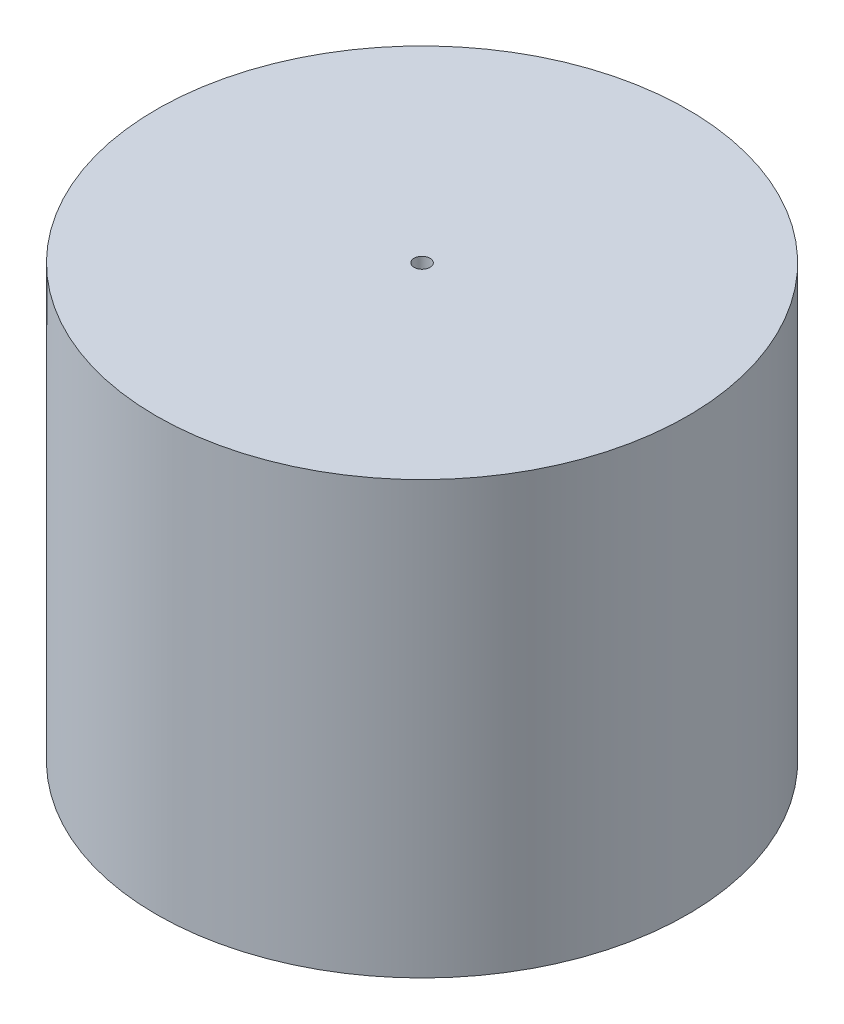
ISO-10303-21;
HEADER;
FILE_DESCRIPTION(('STEP AP214'),'2;1');
FILE_NAME('part.step','',(''),(''),'','','');
FILE_SCHEMA(('AUTOMOTIVE_DESIGN { 1 0 10303 214 1 1 1 1 }'));
ENDSEC;
DATA;
#1=APPLICATION_CONTEXT('core data for automotive mechanical design processes');
#2=APPLICATION_PROTOCOL_DEFINITION('international standard','automotive_design',2000,#1);
#3=PRODUCT_CONTEXT('',#1,'mechanical');
#4=PRODUCT('Part','Part','',(#3));
#5=PRODUCT_RELATED_PRODUCT_CATEGORY('part','',(#4));
#6=PRODUCT_DEFINITION_FORMATION('','',#4);
#7=PRODUCT_DEFINITION_CONTEXT('part definition',#1,'design');
#8=PRODUCT_DEFINITION('design','',#6,#7);
#9=PRODUCT_DEFINITION_SHAPE('','',#8);
#10=(LENGTH_UNIT() NAMED_UNIT(*) SI_UNIT(.MILLI.,.METRE.));
#11=(NAMED_UNIT(*) PLANE_ANGLE_UNIT() SI_UNIT($,.RADIAN.));
#12=(NAMED_UNIT(*) SI_UNIT($,.STERADIAN.) SOLID_ANGLE_UNIT());
#13=UNCERTAINTY_MEASURE_WITH_UNIT(LENGTH_MEASURE(1.E-05),#10,'distance_accuracy_value','');
#14=(GEOMETRIC_REPRESENTATION_CONTEXT(3) GLOBAL_UNCERTAINTY_ASSIGNED_CONTEXT((#13)) GLOBAL_UNIT_ASSIGNED_CONTEXT((#10,
#11,#12)) REPRESENTATION_CONTEXT('',''));
#15=CARTESIAN_POINT('',(0.,0.,0.));
#16=DIRECTION('',(0.,0.,1.));
#17=DIRECTION('',(1.,0.,0.));
#18=AXIS2_PLACEMENT_3D('',#15,#16,#17);
#19=CARTESIAN_POINT('',(0.,-7.5,0.));
#20=DIRECTION('',(0.,1.,0.));
#21=DIRECTION('',(0.,0.,1.));
#22=AXIS2_PLACEMENT_3D('',#19,#20,#21);
#23=PLANE('',#22);
#24=CARTESIAN_POINT('',(0.,-7.5,0.));
#25=DIRECTION('',(0.,1.,0.));
#26=DIRECTION('',(0.,0.,1.));
#27=AXIS2_PLACEMENT_3D('',#24,#25,#26);
#28=CIRCLE('',#27,3.6);
#29=CARTESIAN_POINT('',(0.,-7.5,3.6));
#30=VERTEX_POINT('',#29);
#31=EDGE_CURVE('E11',#30,#30,#28,.T.);
#32=ORIENTED_EDGE('',*,*,#31,.T.);
#33=EDGE_LOOP('',(#32));
#34=FACE_BOUND('',#33,.T.);
#35=CARTESIAN_POINT('',(0.,-7.5,0.));
#36=DIRECTION('',(0.,-1.,0.));
#37=DIRECTION('',(0.,0.,-1.));
#38=AXIS2_PLACEMENT_3D('',#35,#36,#37);
#39=CIRCLE('',#38,12.5);
#40=CARTESIAN_POINT('',(0.,-7.5,-12.5));
#41=VERTEX_POINT('',#40);
#42=CARTESIAN_POINT('',(0.,-7.5,12.5));
#43=VERTEX_POINT('',#42);
#44=EDGE_CURVE('E177',#41,#43,#39,.T.);
#45=ORIENTED_EDGE('',*,*,#44,.T.);
#46=DIRECTION('',(1.,0.,0.));
#47=VECTOR('',#46,1.);
#48=CARTESIAN_POINT('',(-20.,-7.5,12.5));
#49=LINE('',#48,#47);
#50=CARTESIAN_POINT('',(-15.612494995996,-7.5,12.5));
#51=VERTEX_POINT('',#50);
#52=EDGE_CURVE('E264',#51,#43,#49,.T.);
#53=ORIENTED_EDGE('',*,*,#52,.F.);
#54=CARTESIAN_POINT('',(0.,-7.5,0.));
#55=DIRECTION('',(0.,1.,0.));
#56=DIRECTION('',(0.,0.,1.));
#57=AXIS2_PLACEMENT_3D('',#54,#55,#56);
#58=CIRCLE('',#57,20.);
#59=CARTESIAN_POINT('',(-15.612494995996,-7.5,-12.5));
#60=VERTEX_POINT('',#59);
#61=EDGE_CURVE('E314',#51,#60,#58,.F.);
#62=ORIENTED_EDGE('',*,*,#61,.T.);
#63=DIRECTION('',(1.,0.,0.));
#64=VECTOR('',#63,1.);
#65=CARTESIAN_POINT('',(-20.,-7.5,-12.5));
#66=LINE('',#65,#64);
#67=EDGE_CURVE('E267',#60,#41,#66,.T.);
#68=ORIENTED_EDGE('',*,*,#67,.T.);
#69=EDGE_LOOP('',(#45,#53,#62,#68));
#70=FACE_BOUND('',#69,.T.);
#71=ADVANCED_FACE('F36',(#34,#70),#23,.F.);
#72=CARTESIAN_POINT('',(0.,-22.5,0.));
#73=DIRECTION('',(0.,1.,0.));
#74=DIRECTION('',(0.,0.,1.));
#75=AXIS2_PLACEMENT_3D('',#72,#73,#74);
#76=CYLINDRICAL_SURFACE('',#75,12.5);
#77=DIRECTION('',(0.,1.,0.));
#78=VECTOR('',#77,1.);
#79=CARTESIAN_POINT('',(-10.,-22.5,-7.5));
#80=LINE('',#79,#78);
#81=CARTESIAN_POINT('',(-10.,-22.5,-7.5));
#82=VERTEX_POINT('',#81);
#83=CARTESIAN_POINT('',(-10.,-17.5,-7.5));
#84=VERTEX_POINT('',#83);
#85=EDGE_CURVE('E306',#82,#84,#80,.T.);
#86=ORIENTED_EDGE('',*,*,#85,.F.);
#87=CARTESIAN_POINT('',(0.,-22.5,0.));
#88=DIRECTION('',(0.,-1.,0.));
#89=DIRECTION('',(0.,0.,-1.));
#90=AXIS2_PLACEMENT_3D('',#87,#88,#89);
#91=CIRCLE('',#90,12.5);
#92=CARTESIAN_POINT('',(-10.,-22.5,7.5));
#93=VERTEX_POINT('',#92);
#94=EDGE_CURVE('E252',#82,#93,#91,.T.);
#95=ORIENTED_EDGE('',*,*,#94,.T.);
#96=DIRECTION('',(0.,1.,0.));
#97=VECTOR('',#96,1.);
#98=CARTESIAN_POINT('',(-10.,-22.5,7.5));
#99=LINE('',#98,#97);
#100=CARTESIAN_POINT('',(-10.,-17.5,7.5));
#101=VERTEX_POINT('',#100);
#102=EDGE_CURVE('E245',#101,#93,#99,.F.);
#103=ORIENTED_EDGE('',*,*,#102,.F.);
#104=CARTESIAN_POINT('',(0.,-17.5,0.));
#105=DIRECTION('',(0.,-1.,0.));
#106=DIRECTION('',(0.,0.,-1.));
#107=AXIS2_PLACEMENT_3D('',#104,#105,#106);
#108=CIRCLE('',#107,12.5);
#109=CARTESIAN_POINT('',(0.,-17.5,12.5));
#110=VERTEX_POINT('',#109);
#111=EDGE_CURVE('E174',#110,#101,#108,.T.);
#112=ORIENTED_EDGE('',*,*,#111,.F.);
#113=DIRECTION('',(0.,-1.,0.));
#114=VECTOR('',#113,1.);
#115=CARTESIAN_POINT('',(0.,-7.5,12.5));
#116=LINE('',#115,#114);
#117=EDGE_CURVE('E276',#43,#110,#116,.T.);
#118=ORIENTED_EDGE('',*,*,#117,.F.);
#119=ORIENTED_EDGE('',*,*,#44,.F.);
#120=DIRECTION('',(0.,1.,0.));
#121=VECTOR('',#120,1.);
#122=CARTESIAN_POINT('',(0.,-7.5,-12.5));
#123=LINE('',#122,#121);
#124=CARTESIAN_POINT('',(0.,-17.5,-12.5));
#125=VERTEX_POINT('',#124);
#126=EDGE_CURVE('E273',#125,#41,#123,.T.);
#127=ORIENTED_EDGE('',*,*,#126,.F.);
#128=CARTESIAN_POINT('',(0.,-17.5,0.));
#129=DIRECTION('',(0.,-1.,0.));
#130=DIRECTION('',(0.,0.,-1.));
#131=AXIS2_PLACEMENT_3D('',#128,#129,#130);
#132=CIRCLE('',#131,12.5);
#133=EDGE_CURVE('E182',#84,#125,#132,.T.);
#134=ORIENTED_EDGE('',*,*,#133,.F.);
#135=EDGE_LOOP('',(#86,#95,#103,#112,#118,#119,#127,#134));
#136=FACE_BOUND('',#135,.T.);
#137=ADVANCED_FACE('F201',(#136),#76,.F.);
#138=CARTESIAN_POINT('',(0.,-22.5,0.));
#139=DIRECTION('',(0.,-1.,0.));
#140=DIRECTION('',(0.,0.,-1.));
#141=AXIS2_PLACEMENT_3D('',#138,#139,#140);
#142=PLANE('',#141);
#143=ORIENTED_EDGE('',*,*,#94,.F.);
#144=DIRECTION('',(1.,0.,0.));
#145=VECTOR('',#144,1.);
#146=CARTESIAN_POINT('',(0.,-22.5,-7.5));
#147=LINE('',#146,#145);
#148=CARTESIAN_POINT('',(-6.88856760882264,-22.5,-7.5));
#149=VERTEX_POINT('',#148);
#150=EDGE_CURVE('E304',#82,#149,#147,.T.);
#151=ORIENTED_EDGE('',*,*,#150,.T.);
#152=DIRECTION('',(0.851038037822176,0.,-0.525104045099427));
#153=VECTOR('',#152,1.);
#154=CARTESIAN_POINT('',(-10.1645108532667,-22.5,-5.47869076031458));
#155=LINE('',#154,#153);
#156=CARTESIAN_POINT('',(-0.337570048721829,-22.5,-11.5420699961289));
#157=VERTEX_POINT('',#156);
#158=EDGE_CURVE('E59',#149,#157,#155,.T.);
#159=ORIENTED_EDGE('',*,*,#158,.T.);
#160=DIRECTION('',(0.880272461597161,0.,0.474468537791152));
#161=VECTOR('',#160,1.);
#162=CARTESIAN_POINT('',(-0.337570048721829,-22.5,-11.5420699961289));
#163=LINE('',#162,#161);
#164=CARTESIAN_POINT('',(9.82694080454485,-22.5,-6.0633792358143));
#165=VERTEX_POINT('',#164);
#166=EDGE_CURVE('E332',#157,#165,#163,.T.);
#167=ORIENTED_EDGE('',*,*,#166,.T.);
#168=DIRECTION('',(0.0292344237749851,0.,0.99957258289058));
#169=VECTOR('',#168,1.);
#170=CARTESIAN_POINT('',(9.82694080454485,-22.5,-6.0633792358143));
#171=LINE('',#170,#169);
#172=CARTESIAN_POINT('',(10.1645108532667,-22.5,5.47869076031458));
#173=VERTEX_POINT('',#172);
#174=EDGE_CURVE('E334',#165,#173,#171,.T.);
#175=ORIENTED_EDGE('',*,*,#174,.T.);
#176=DIRECTION('',(-0.851038037822176,0.,0.525104045099427));
#177=VECTOR('',#176,1.);
#178=CARTESIAN_POINT('',(10.1645108532667,-22.5,5.47869076031458));
#179=LINE('',#178,#177);
#180=CARTESIAN_POINT('',(0.337570048721818,-22.5,11.5420699961289));
#181=VERTEX_POINT('',#180);
#182=EDGE_CURVE('E337',#173,#181,#179,.T.);
#183=ORIENTED_EDGE('',*,*,#182,.T.);
#184=DIRECTION('',(-0.880272461597161,0.,-0.474468537791153));
#185=VECTOR('',#184,1.);
#186=CARTESIAN_POINT('',(0.337570048721818,-22.5,11.5420699961289));
#187=LINE('',#186,#185);
#188=CARTESIAN_POINT('',(-7.16160560158564,-22.5,7.5));
#189=VERTEX_POINT('',#188);
#190=EDGE_CURVE('E322',#181,#189,#187,.T.);
#191=ORIENTED_EDGE('',*,*,#190,.T.);
#192=DIRECTION('',(-1.,0.,0.));
#193=VECTOR('',#192,1.);
#194=CARTESIAN_POINT('',(0.,-22.5,7.5));
#195=LINE('',#194,#193);
#196=EDGE_CURVE('E299',#189,#93,#195,.T.);
#197=ORIENTED_EDGE('',*,*,#196,.T.);
#198=EDGE_LOOP('',(#143,#151,#159,#167,#175,#183,#191,#197));
#199=FACE_BOUND('',#198,.T.);
#200=ADVANCED_FACE('F209',(#199),#142,.F.);
#201=CARTESIAN_POINT('',(-10.1645108532667,-27.5,-5.47869076031458));
#202=DIRECTION('',(0.525104045099427,0.,0.851038037822176));
#203=DIRECTION('',(0.851038037822176,0.,-0.525104045099427));
#204=AXIS2_PLACEMENT_3D('',#201,#202,#203);
#205=PLANE('',#204);
#206=DIRECTION('',(0.,1.,0.));
#207=VECTOR('',#206,1.);
#208=CARTESIAN_POINT('',(-6.88856760882264,-27.5,-7.5));
#209=LINE('',#208,#207);
#210=CARTESIAN_POINT('',(-6.88856760882264,-27.5,-7.5));
#211=VERTEX_POINT('',#210);
#212=EDGE_CURVE('E244',#211,#149,#209,.T.);
#213=ORIENTED_EDGE('',*,*,#212,.F.);
#214=DIRECTION('',(0.851038037822176,0.,-0.525104045099427));
#215=VECTOR('',#214,1.);
#216=CARTESIAN_POINT('',(-10.1645108532667,-27.5,-5.47869076031458));
#217=LINE('',#216,#215);
#218=CARTESIAN_POINT('',(-0.337570048721829,-27.5,-11.5420699961289));
#219=VERTEX_POINT('',#218);
#220=EDGE_CURVE('E319',#211,#219,#217,.T.);
#221=ORIENTED_EDGE('',*,*,#220,.T.);
#222=DIRECTION('',(0.,1.,0.));
#223=VECTOR('',#222,1.);
#224=CARTESIAN_POINT('',(-0.337570048721829,-27.5,-11.5420699961289));
#225=LINE('',#224,#223);
#226=EDGE_CURVE('E253',#219,#157,#225,.T.);
#227=ORIENTED_EDGE('',*,*,#226,.T.);
#228=ORIENTED_EDGE('',*,*,#158,.F.);
#229=EDGE_LOOP('',(#213,#221,#227,#228));
#230=FACE_BOUND('',#229,.T.);
#231=ADVANCED_FACE('F357',(#230),#205,.T.);
#232=CARTESIAN_POINT('',(-0.337570048721829,-27.5,-11.5420699961289));
#233=DIRECTION('',(-0.474468537791152,0.,0.880272461597161));
#234=DIRECTION('',(0.880272461597161,0.,0.474468537791152));
#235=AXIS2_PLACEMENT_3D('',#232,#233,#234);
#236=PLANE('',#235);
#237=ORIENTED_EDGE('',*,*,#166,.F.);
#238=ORIENTED_EDGE('',*,*,#226,.F.);
#239=DIRECTION('',(0.880272461597161,0.,0.474468537791152));
#240=VECTOR('',#239,1.);
#241=CARTESIAN_POINT('',(-0.337570048721829,-27.5,-11.5420699961289));
#242=LINE('',#241,#240);
#243=CARTESIAN_POINT('',(9.82694080454485,-27.5,-6.0633792358143));
#244=VERTEX_POINT('',#243);
#245=EDGE_CURVE('E321',#219,#244,#242,.T.);
#246=ORIENTED_EDGE('',*,*,#245,.T.);
#247=DIRECTION('',(0.,1.,0.));
#248=VECTOR('',#247,1.);
#249=CARTESIAN_POINT('',(9.82694080454485,-27.5,-6.0633792358143));
#250=LINE('',#249,#248);
#251=EDGE_CURVE('E258',#244,#165,#250,.T.);
#252=ORIENTED_EDGE('',*,*,#251,.T.);
#253=EDGE_LOOP('',(#237,#238,#246,#252));
#254=FACE_BOUND('',#253,.T.);
#255=ADVANCED_FACE('F347',(#254),#236,.T.);
#256=CARTESIAN_POINT('',(9.82694080454485,-27.5,-6.0633792358143));
#257=DIRECTION('',(-0.99957258289058,0.,0.0292344237749851));
#258=DIRECTION('',(0.0292344237749851,0.,0.99957258289058));
#259=AXIS2_PLACEMENT_3D('',#256,#257,#258);
#260=PLANE('',#259);
#261=ORIENTED_EDGE('',*,*,#174,.F.);
#262=ORIENTED_EDGE('',*,*,#251,.F.);
#263=DIRECTION('',(0.0292344237749851,0.,0.99957258289058));
#264=VECTOR('',#263,1.);
#265=CARTESIAN_POINT('',(9.82694080454485,-27.5,-6.0633792358143));
#266=LINE('',#265,#264);
#267=CARTESIAN_POINT('',(10.1645108532667,-27.5,5.47869076031458));
#268=VERTEX_POINT('',#267);
#269=EDGE_CURVE('E324',#244,#268,#266,.T.);
#270=ORIENTED_EDGE('',*,*,#269,.T.);
#271=DIRECTION('',(0.,1.,0.));
#272=VECTOR('',#271,1.);
#273=CARTESIAN_POINT('',(10.1645108532667,-27.5,5.47869076031458));
#274=LINE('',#273,#272);
#275=EDGE_CURVE('E343',#268,#173,#274,.T.);
#276=ORIENTED_EDGE('',*,*,#275,.T.);
#277=EDGE_LOOP('',(#261,#262,#270,#276));
#278=FACE_BOUND('',#277,.T.);
#279=ADVANCED_FACE('F352',(#278),#260,.T.);
#280=CARTESIAN_POINT('',(10.1645108532667,-27.5,5.47869076031458));
#281=DIRECTION('',(-0.525104045099427,0.,-0.851038037822176));
#282=DIRECTION('',(-0.851038037822176,0.,0.525104045099427));
#283=AXIS2_PLACEMENT_3D('',#280,#281,#282);
#284=PLANE('',#283);
#285=ORIENTED_EDGE('',*,*,#182,.F.);
#286=ORIENTED_EDGE('',*,*,#275,.F.);
#287=DIRECTION('',(-0.851038037822176,0.,0.525104045099427));
#288=VECTOR('',#287,1.);
#289=CARTESIAN_POINT('',(10.1645108532667,-27.5,5.47869076031458));
#290=LINE('',#289,#288);
#291=CARTESIAN_POINT('',(0.337570048721818,-27.5,11.5420699961289));
#292=VERTEX_POINT('',#291);
#293=EDGE_CURVE('E326',#268,#292,#290,.T.);
#294=ORIENTED_EDGE('',*,*,#293,.T.);
#295=DIRECTION('',(0.,1.,0.));
#296=VECTOR('',#295,1.);
#297=CARTESIAN_POINT('',(0.337570048721818,-27.5,11.5420699961289));
#298=LINE('',#297,#296);
#299=EDGE_CURVE('E330',#292,#181,#298,.T.);
#300=ORIENTED_EDGE('',*,*,#299,.T.);
#301=EDGE_LOOP('',(#285,#286,#294,#300));
#302=FACE_BOUND('',#301,.T.);
#303=ADVANCED_FACE('F370',(#302),#284,.T.);
#304=CARTESIAN_POINT('',(0.337570048721818,-27.5,11.5420699961289));
#305=DIRECTION('',(0.474468537791153,0.,-0.880272461597161));
#306=DIRECTION('',(-0.880272461597161,0.,-0.474468537791153));
#307=AXIS2_PLACEMENT_3D('',#304,#305,#306);
#308=PLANE('',#307);
#309=DIRECTION('',(0.,-1.,0.));
#310=VECTOR('',#309,1.);
#311=CARTESIAN_POINT('',(-7.16160560158564,-27.5,7.5));
#312=LINE('',#311,#310);
#313=CARTESIAN_POINT('',(-7.16160560158564,-27.5,7.5));
#314=VERTEX_POINT('',#313);
#315=EDGE_CURVE('E170',#189,#314,#312,.T.);
#316=ORIENTED_EDGE('',*,*,#315,.F.);
#317=ORIENTED_EDGE('',*,*,#190,.F.);
#318=ORIENTED_EDGE('',*,*,#299,.F.);
#319=DIRECTION('',(-0.880272461597161,0.,-0.474468537791153));
#320=VECTOR('',#319,1.);
#321=CARTESIAN_POINT('',(0.337570048721818,-27.5,11.5420699961289));
#322=LINE('',#321,#320);
#323=EDGE_CURVE('E328',#292,#314,#322,.T.);
#324=ORIENTED_EDGE('',*,*,#323,.T.);
#325=EDGE_LOOP('',(#316,#317,#318,#324));
#326=FACE_BOUND('',#325,.T.);
#327=ADVANCED_FACE('F373',(#326),#308,.T.);
#328=CARTESIAN_POINT('',(0.,-27.5,0.));
#329=DIRECTION('',(0.,-1.,0.));
#330=DIRECTION('',(0.,0.,-1.));
#331=AXIS2_PLACEMENT_3D('',#328,#329,#330);
#332=PLANE('',#331);
#333=DIRECTION('',(1.,0.,0.));
#334=VECTOR('',#333,1.);
#335=CARTESIAN_POINT('',(0.,-27.5,-7.5));
#336=LINE('',#335,#334);
#337=CARTESIAN_POINT('',(-2.78388218141501,-27.5,-7.5));
#338=VERTEX_POINT('',#337);
#339=EDGE_CURVE('E165',#211,#338,#336,.T.);
#340=ORIENTED_EDGE('',*,*,#339,.T.);
#341=CARTESIAN_POINT('',(0.,-27.5,0.));
#342=DIRECTION('',(0.,-1.,0.));
#343=DIRECTION('',(0.,0.,-1.));
#344=AXIS2_PLACEMENT_3D('',#341,#342,#343);
#345=CIRCLE('',#344,8.);
#346=CARTESIAN_POINT('',(-2.78388218141501,-27.5,7.5));
#347=VERTEX_POINT('',#346);
#348=EDGE_CURVE('E152',#338,#347,#345,.T.);
#349=ORIENTED_EDGE('',*,*,#348,.T.);
#350=DIRECTION('',(-1.,0.,0.));
#351=VECTOR('',#350,1.);
#352=CARTESIAN_POINT('',(0.,-27.5,7.5));
#353=LINE('',#352,#351);
#354=EDGE_CURVE('E162',#347,#314,#353,.T.);
#355=ORIENTED_EDGE('',*,*,#354,.T.);
#356=ORIENTED_EDGE('',*,*,#323,.F.);
#357=ORIENTED_EDGE('',*,*,#293,.F.);
#358=ORIENTED_EDGE('',*,*,#269,.F.);
#359=ORIENTED_EDGE('',*,*,#245,.F.);
#360=ORIENTED_EDGE('',*,*,#220,.F.);
#361=EDGE_LOOP('',(#340,#349,#355,#356,#357,#358,#359,#360));
#362=FACE_BOUND('',#361,.T.);
#363=ADVANCED_FACE('F160',(#362),#332,.F.);
#364=CARTESIAN_POINT('',(-20.,-17.5,-7.5));
#365=DIRECTION('',(0.,0.,-1.));
#366=DIRECTION('',(0.,1.,0.));
#367=AXIS2_PLACEMENT_3D('',#364,#365,#366);
#368=PLANE('',#367);
#369=DIRECTION('',(1.,0.,0.));
#370=VECTOR('',#369,1.);
#371=CARTESIAN_POINT('',(-20.,-32.5,-7.5));
#372=LINE('',#371,#370);
#373=CARTESIAN_POINT('',(-18.5404962177392,-32.5,-7.5));
#374=VERTEX_POINT('',#373);
#375=CARTESIAN_POINT('',(-2.78388218141501,-32.5,-7.5));
#376=VERTEX_POINT('',#375);
#377=EDGE_CURVE('E251',#374,#376,#372,.T.);
#378=ORIENTED_EDGE('',*,*,#377,.T.);
#379=DIRECTION('',(0.,-1.,0.));
#380=VECTOR('',#379,1.);
#381=CARTESIAN_POINT('',(-2.78388218141501,-27.5,-7.5));
#382=LINE('',#381,#380);
#383=EDGE_CURVE('E51',#376,#338,#382,.F.);
#384=ORIENTED_EDGE('',*,*,#383,.T.);
#385=ORIENTED_EDGE('',*,*,#339,.F.);
#386=ORIENTED_EDGE('',*,*,#212,.T.);
#387=ORIENTED_EDGE('',*,*,#150,.F.);
#388=ORIENTED_EDGE('',*,*,#85,.T.);
#389=DIRECTION('',(1.,0.,0.));
#390=VECTOR('',#389,1.);
#391=CARTESIAN_POINT('',(-20.,-17.5,-7.5));
#392=LINE('',#391,#390);
#393=CARTESIAN_POINT('',(-18.5404962177392,-17.5,-7.5));
#394=VERTEX_POINT('',#393);
#395=EDGE_CURVE('E280',#394,#84,#392,.T.);
#396=ORIENTED_EDGE('',*,*,#395,.F.);
#397=DIRECTION('',(0.,1.,0.));
#398=VECTOR('',#397,1.);
#399=CARTESIAN_POINT('',(-18.5404962177392,-7.5,-7.5));
#400=LINE('',#399,#398);
#401=EDGE_CURVE('E308',#394,#374,#400,.F.);
#402=ORIENTED_EDGE('',*,*,#401,.T.);
#403=EDGE_LOOP('',(#378,#384,#385,#386,#387,#388,#396,#402));
#404=FACE_BOUND('',#403,.T.);
#405=ADVANCED_FACE('F380',(#404),#368,.F.);
#406=CARTESIAN_POINT('',(-20.,-17.5,7.5));
#407=DIRECTION('',(0.,0.,1.));
#408=DIRECTION('',(0.,-1.,0.));
#409=AXIS2_PLACEMENT_3D('',#406,#407,#408);
#410=PLANE('',#409);
#411=ORIENTED_EDGE('',*,*,#354,.F.);
#412=DIRECTION('',(0.,-1.,0.));
#413=VECTOR('',#412,1.);
#414=CARTESIAN_POINT('',(-2.78388218141501,-27.5,7.5));
#415=LINE('',#414,#413);
#416=CARTESIAN_POINT('',(-2.78388218141501,-32.5,7.5));
#417=VERTEX_POINT('',#416);
#418=EDGE_CURVE('E149',#347,#417,#415,.T.);
#419=ORIENTED_EDGE('',*,*,#418,.T.);
#420=DIRECTION('',(1.,0.,0.));
#421=VECTOR('',#420,1.);
#422=CARTESIAN_POINT('',(-20.,-32.5,7.5));
#423=LINE('',#422,#421);
#424=CARTESIAN_POINT('',(-18.5404962177392,-32.5,7.5));
#425=VERTEX_POINT('',#424);
#426=EDGE_CURVE('E249',#425,#417,#423,.T.);
#427=ORIENTED_EDGE('',*,*,#426,.F.);
#428=DIRECTION('',(0.,1.,0.));
#429=VECTOR('',#428,1.);
#430=CARTESIAN_POINT('',(-18.5404962177392,-7.5,7.5));
#431=LINE('',#430,#429);
#432=CARTESIAN_POINT('',(-18.5404962177392,-17.5,7.5));
#433=VERTEX_POINT('',#432);
#434=EDGE_CURVE('E234',#425,#433,#431,.T.);
#435=ORIENTED_EDGE('',*,*,#434,.T.);
#436=DIRECTION('',(1.,0.,0.));
#437=VECTOR('',#436,1.);
#438=CARTESIAN_POINT('',(-20.,-17.5,7.5));
#439=LINE('',#438,#437);
#440=EDGE_CURVE('E290',#433,#101,#439,.T.);
#441=ORIENTED_EDGE('',*,*,#440,.T.);
#442=ORIENTED_EDGE('',*,*,#102,.T.);
#443=ORIENTED_EDGE('',*,*,#196,.F.);
#444=ORIENTED_EDGE('',*,*,#315,.T.);
#445=EDGE_LOOP('',(#411,#419,#427,#435,#441,#442,#443,#444));
#446=FACE_BOUND('',#445,.T.);
#447=ADVANCED_FACE('F168',(#446),#410,.F.);
#448=CARTESIAN_POINT('',(-20.,-17.5,12.5));
#449=DIRECTION('',(0.,-1.,0.));
#450=DIRECTION('',(0.,0.,-1.));
#451=AXIS2_PLACEMENT_3D('',#448,#449,#450);
#452=PLANE('',#451);
#453=CARTESIAN_POINT('',(0.,-17.5,0.));
#454=DIRECTION('',(0.,-1.,0.));
#455=DIRECTION('',(0.,0.,-1.));
#456=AXIS2_PLACEMENT_3D('',#453,#454,#455);
#457=CIRCLE('',#456,20.);
#458=CARTESIAN_POINT('',(-15.612494995996,-17.5,12.5));
#459=VERTEX_POINT('',#458);
#460=EDGE_CURVE('E241',#433,#459,#457,.F.);
#461=ORIENTED_EDGE('',*,*,#460,.T.);
#462=DIRECTION('',(1.,0.,0.));
#463=VECTOR('',#462,1.);
#464=CARTESIAN_POINT('',(-20.,-17.5,12.5));
#465=LINE('',#464,#463);
#466=EDGE_CURVE('E292',#459,#110,#465,.T.);
#467=ORIENTED_EDGE('',*,*,#466,.T.);
#468=ORIENTED_EDGE('',*,*,#111,.T.);
#469=ORIENTED_EDGE('',*,*,#440,.F.);
#470=EDGE_LOOP('',(#461,#467,#468,#469));
#471=FACE_BOUND('',#470,.T.);
#472=ADVANCED_FACE('F390',(#471),#452,.F.);
#473=CARTESIAN_POINT('',(-20.,-7.5,12.5));
#474=DIRECTION('',(0.,0.,1.));
#475=DIRECTION('',(0.,-1.,0.));
#476=AXIS2_PLACEMENT_3D('',#473,#474,#475);
#477=PLANE('',#476);
#478=DIRECTION('',(0.,1.,0.));
#479=VECTOR('',#478,1.);
#480=CARTESIAN_POINT('',(-15.612494995996,-7.5,12.5));
#481=LINE('',#480,#479);
#482=EDGE_CURVE('E316',#459,#51,#481,.T.);
#483=ORIENTED_EDGE('',*,*,#482,.T.);
#484=ORIENTED_EDGE('',*,*,#52,.T.);
#485=ORIENTED_EDGE('',*,*,#117,.T.);
#486=ORIENTED_EDGE('',*,*,#466,.F.);
#487=EDGE_LOOP('',(#483,#484,#485,#486));
#488=FACE_BOUND('',#487,.T.);
#489=ADVANCED_FACE('F386',(#488),#477,.F.);
#490=CARTESIAN_POINT('',(-20.,-7.5,-12.5));
#491=DIRECTION('',(0.,0.,-1.));
#492=DIRECTION('',(-1.,0.,0.));
#493=AXIS2_PLACEMENT_3D('',#490,#491,#492);
#494=PLANE('',#493);
#495=DIRECTION('',(0.,1.,0.));
#496=VECTOR('',#495,1.);
#497=CARTESIAN_POINT('',(-15.612494995996,-7.5,-12.5));
#498=LINE('',#497,#496);
#499=CARTESIAN_POINT('',(-15.612494995996,-17.5,-12.5));
#500=VERTEX_POINT('',#499);
#501=EDGE_CURVE('E312',#60,#500,#498,.F.);
#502=ORIENTED_EDGE('',*,*,#501,.T.);
#503=DIRECTION('',(1.,0.,0.));
#504=VECTOR('',#503,1.);
#505=CARTESIAN_POINT('',(-20.,-17.5,-12.5));
#506=LINE('',#505,#504);
#507=EDGE_CURVE('E283',#500,#125,#506,.T.);
#508=ORIENTED_EDGE('',*,*,#507,.T.);
#509=ORIENTED_EDGE('',*,*,#126,.T.);
#510=ORIENTED_EDGE('',*,*,#67,.F.);
#511=EDGE_LOOP('',(#502,#508,#509,#510));
#512=FACE_BOUND('',#511,.T.);
#513=ADVANCED_FACE('F227',(#512),#494,.F.);
#514=CARTESIAN_POINT('',(-20.,-17.5,-7.5));
#515=DIRECTION('',(0.,-1.,0.));
#516=DIRECTION('',(0.,0.,-1.));
#517=AXIS2_PLACEMENT_3D('',#514,#515,#516);
#518=PLANE('',#517);
#519=CARTESIAN_POINT('',(0.,-17.5,0.));
#520=DIRECTION('',(0.,-1.,0.));
#521=DIRECTION('',(0.,0.,-1.));
#522=AXIS2_PLACEMENT_3D('',#519,#520,#521);
#523=CIRCLE('',#522,20.);
#524=EDGE_CURVE('E310',#500,#394,#523,.F.);
#525=ORIENTED_EDGE('',*,*,#524,.T.);
#526=ORIENTED_EDGE('',*,*,#395,.T.);
#527=ORIENTED_EDGE('',*,*,#133,.T.);
#528=ORIENTED_EDGE('',*,*,#507,.F.);
#529=EDGE_LOOP('',(#525,#526,#527,#528));
#530=FACE_BOUND('',#529,.T.);
#531=ADVANCED_FACE('F221',(#530),#518,.F.);
#532=CARTESIAN_POINT('',(0.,-7.5,0.));
#533=DIRECTION('',(0.,1.,0.));
#534=DIRECTION('',(0.,0.,1.));
#535=AXIS2_PLACEMENT_3D('',#532,#533,#534);
#536=CYLINDRICAL_SURFACE('',#535,20.);
#537=ORIENTED_EDGE('',*,*,#434,.F.);
#538=CARTESIAN_POINT('',(0.,-32.5,0.));
#539=DIRECTION('',(0.,-1.,0.));
#540=DIRECTION('',(0.,0.,-1.));
#541=AXIS2_PLACEMENT_3D('',#538,#539,#540);
#542=CIRCLE('',#541,20.);
#543=EDGE_CURVE('E239',#374,#425,#542,.T.);
#544=ORIENTED_EDGE('',*,*,#543,.F.);
#545=ORIENTED_EDGE('',*,*,#401,.F.);
#546=ORIENTED_EDGE('',*,*,#524,.F.);
#547=ORIENTED_EDGE('',*,*,#501,.F.);
#548=ORIENTED_EDGE('',*,*,#61,.F.);
#549=ORIENTED_EDGE('',*,*,#482,.F.);
#550=ORIENTED_EDGE('',*,*,#460,.F.);
#551=EDGE_LOOP('',(#537,#544,#545,#546,#547,#548,#549,#550));
#552=FACE_BOUND('',#551,.T.);
#553=CARTESIAN_POINT('',(0.,0.,0.));
#554=DIRECTION('',(0.,1.,0.));
#555=DIRECTION('',(0.,0.,1.));
#556=AXIS2_PLACEMENT_3D('',#553,#554,#555);
#557=CIRCLE('',#556,20.);
#558=CARTESIAN_POINT('',(0.,0.,20.));
#559=VERTEX_POINT('',#558);
#560=EDGE_CURVE('E172',#559,#559,#557,.T.);
#561=ORIENTED_EDGE('',*,*,#560,.F.);
#562=EDGE_LOOP('',(#561));
#563=FACE_BOUND('',#562,.T.);
#564=ADVANCED_FACE('F218',(#552,#563),#536,.T.);
#565=CARTESIAN_POINT('',(0.,0.,0.));
#566=DIRECTION('',(0.,1.,0.));
#567=DIRECTION('',(0.,0.,1.));
#568=AXIS2_PLACEMENT_3D('',#565,#566,#567);
#569=PLANE('',#568);
#570=CARTESIAN_POINT('',(0.,0.,0.));
#571=DIRECTION('',(0.,-1.,0.));
#572=DIRECTION('',(0.,0.,-1.));
#573=AXIS2_PLACEMENT_3D('',#570,#571,#572);
#574=CIRCLE('',#573,0.6);
#575=CARTESIAN_POINT('',(0.,0.,-0.6));
#576=VERTEX_POINT('',#575);
#577=EDGE_CURVE('E410',#576,#576,#574,.T.);
#578=ORIENTED_EDGE('',*,*,#577,.T.);
#579=EDGE_LOOP('',(#578));
#580=FACE_BOUND('',#579,.T.);
#581=ORIENTED_EDGE('',*,*,#560,.T.);
#582=EDGE_LOOP('',(#581));
#583=FACE_BOUND('',#582,.T.);
#584=ADVANCED_FACE('F215',(#580,#583),#569,.T.);
#585=CARTESIAN_POINT('',(0.,-32.5,0.));
#586=DIRECTION('',(0.,-1.,0.));
#587=DIRECTION('',(0.,0.,-1.));
#588=AXIS2_PLACEMENT_3D('',#585,#586,#587);
#589=PLANE('',#588);
#590=CARTESIAN_POINT('',(0.,-32.5,0.));
#591=DIRECTION('',(0.,-1.,0.));
#592=DIRECTION('',(0.,0.,-1.));
#593=AXIS2_PLACEMENT_3D('',#590,#591,#592);
#594=CIRCLE('',#593,8.);
#595=EDGE_CURVE('E153',#376,#417,#594,.T.);
#596=ORIENTED_EDGE('',*,*,#595,.F.);
#597=ORIENTED_EDGE('',*,*,#377,.F.);
#598=ORIENTED_EDGE('',*,*,#543,.T.);
#599=ORIENTED_EDGE('',*,*,#426,.T.);
#600=EDGE_LOOP('',(#596,#597,#598,#599));
#601=FACE_BOUND('',#600,.T.);
#602=ADVANCED_FACE('F217',(#601),#589,.T.);
#603=CARTESIAN_POINT('',(0.,-27.5,0.));
#604=DIRECTION('',(0.,-1.,0.));
#605=DIRECTION('',(0.,0.,-1.));
#606=AXIS2_PLACEMENT_3D('',#603,#604,#605);
#607=CYLINDRICAL_SURFACE('',#606,8.);
#608=ORIENTED_EDGE('',*,*,#595,.T.);
#609=ORIENTED_EDGE('',*,*,#418,.F.);
#610=ORIENTED_EDGE('',*,*,#348,.F.);
#611=ORIENTED_EDGE('',*,*,#383,.F.);
#612=EDGE_LOOP('',(#608,#609,#610,#611));
#613=FACE_BOUND('',#612,.T.);
#614=ADVANCED_FACE('F151',(#613),#607,.F.);
#615=CARTESIAN_POINT('',(0.,-3.,0.));
#616=DIRECTION('',(0.,-1.,0.));
#617=DIRECTION('',(0.,0.,-1.));
#618=AXIS2_PLACEMENT_3D('',#615,#616,#617);
#619=CYLINDRICAL_SURFACE('',#618,2.1);
#620=CARTESIAN_POINT('',(0.,-6.,0.));
#621=DIRECTION('',(0.,1.,0.));
#622=DIRECTION('',(0.,0.,1.));
#623=AXIS2_PLACEMENT_3D('',#620,#621,#622);
#624=CIRCLE('',#623,2.1);
#625=CARTESIAN_POINT('',(0.,-6.,2.1));
#626=VERTEX_POINT('',#625);
#627=EDGE_CURVE('E44',#626,#626,#624,.F.);
#628=ORIENTED_EDGE('',*,*,#627,.T.);
#629=EDGE_LOOP('',(#628));
#630=FACE_BOUND('',#629,.T.);
#631=CARTESIAN_POINT('',(0.,-3.,0.));
#632=DIRECTION('',(0.,-1.,0.));
#633=DIRECTION('',(0.,0.,-1.));
#634=AXIS2_PLACEMENT_3D('',#631,#632,#633);
#635=CIRCLE('',#634,2.1);
#636=CARTESIAN_POINT('',(0.,-3.,-2.1));
#637=VERTEX_POINT('',#636);
#638=EDGE_CURVE('E166',#637,#637,#635,.T.);
#639=ORIENTED_EDGE('',*,*,#638,.F.);
#640=EDGE_LOOP('',(#639));
#641=FACE_BOUND('',#640,.T.);
#642=ADVANCED_FACE('F187',(#630,#641),#619,.F.);
#643=CARTESIAN_POINT('',(0.,-3.,0.));
#644=DIRECTION('',(0.,-1.,0.));
#645=DIRECTION('',(0.,0.,-1.));
#646=AXIS2_PLACEMENT_3D('',#643,#644,#645);
#647=PLANE('',#646);
#648=CARTESIAN_POINT('',(0.,-3.,0.));
#649=DIRECTION('',(0.,-1.,0.));
#650=DIRECTION('',(0.,0.,-1.));
#651=AXIS2_PLACEMENT_3D('',#648,#649,#650);
#652=CIRCLE('',#651,0.6);
#653=CARTESIAN_POINT('',(0.,-3.,-0.6));
#654=VERTEX_POINT('',#653);
#655=EDGE_CURVE('E407',#654,#654,#652,.T.);
#656=ORIENTED_EDGE('',*,*,#655,.F.);
#657=EDGE_LOOP('',(#656));
#658=FACE_BOUND('',#657,.T.);
#659=ORIENTED_EDGE('',*,*,#638,.T.);
#660=EDGE_LOOP('',(#659));
#661=FACE_BOUND('',#660,.T.);
#662=ADVANCED_FACE('F196',(#658,#661),#647,.T.);
#663=CARTESIAN_POINT('',(0.,0.,0.));
#664=DIRECTION('',(0.,-1.,0.));
#665=DIRECTION('',(0.,0.,-1.));
#666=AXIS2_PLACEMENT_3D('',#663,#664,#665);
#667=CYLINDRICAL_SURFACE('',#666,0.6);
#668=ORIENTED_EDGE('',*,*,#577,.F.);
#669=EDGE_LOOP('',(#668));
#670=FACE_BOUND('',#669,.T.);
#671=ORIENTED_EDGE('',*,*,#655,.T.);
#672=EDGE_LOOP('',(#671));
#673=FACE_BOUND('',#672,.T.);
#674=ADVANCED_FACE('F191',(#670,#673),#667,.F.);
#675=CARTESIAN_POINT('',(0.,-6.,0.));
#676=DIRECTION('',(0.,1.,0.));
#677=DIRECTION('',(0.,0.,1.));
#678=AXIS2_PLACEMENT_3D('',#675,#676,#677);
#679=TOROIDAL_SURFACE('',#678,3.6,1.5);
#680=ORIENTED_EDGE('',*,*,#31,.F.);
#681=EDGE_LOOP('',(#680));
#682=FACE_BOUND('',#681,.T.);
#683=ORIENTED_EDGE('',*,*,#627,.F.);
#684=EDGE_LOOP('',(#683));
#685=FACE_BOUND('',#684,.T.);
#686=ADVANCED_FACE('F38',(#682,#685),#679,.T.);
#687=CLOSED_SHELL('',(#71,#137,#200,#231,#255,#279,#303,#327,#363,#405,#447,#472,#489,#513,#531,
#564,#584,#602,#614,#642,#662,#674,#686));
#688=MANIFOLD_SOLID_BREP('B2',#687);
#689=ADVANCED_BREP_SHAPE_REPRESENTATION('',(#18,#688),#14);
#690=SHAPE_DEFINITION_REPRESENTATION(#9,#689);
ENDSEC;
END-ISO-10303-21;
